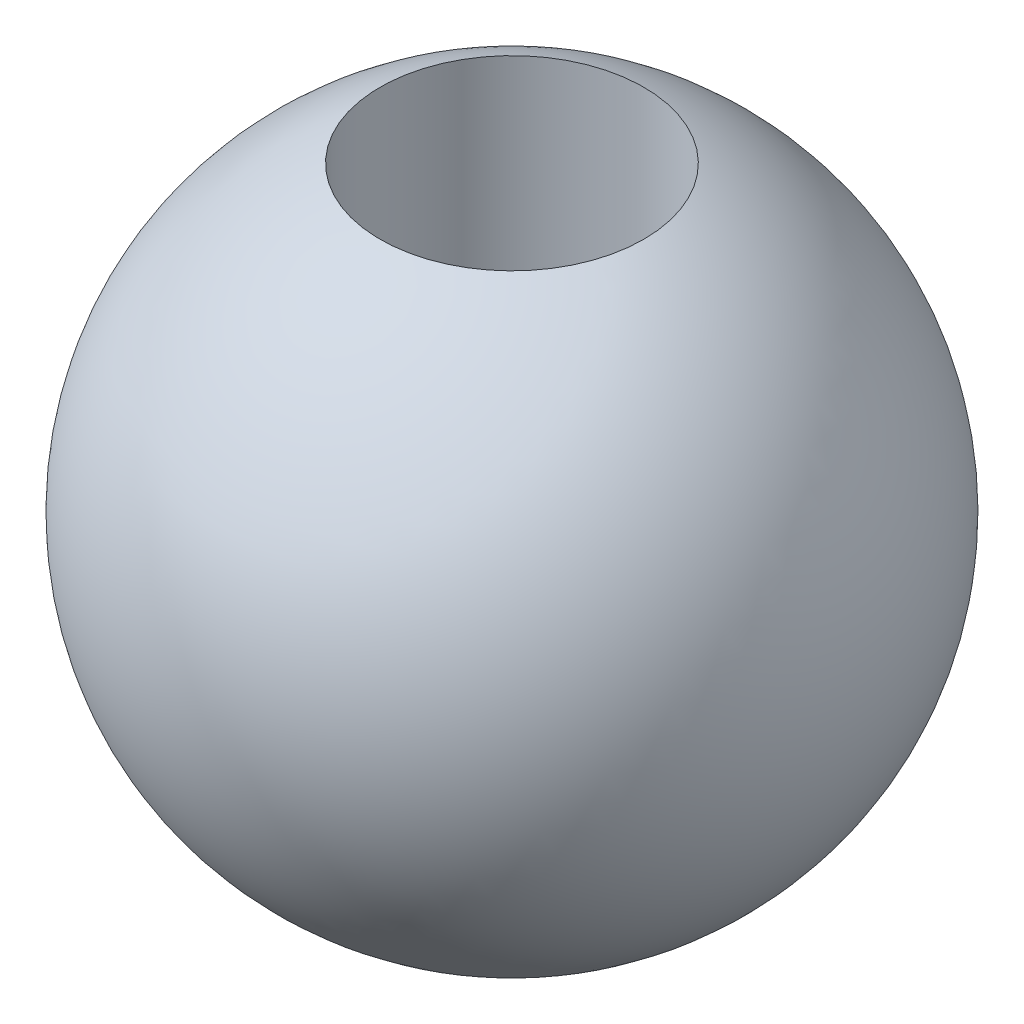
ISO-10303-21;
HEADER;
FILE_DESCRIPTION(('STEP AP214'),'2;1');
FILE_NAME('part.step','',(''),(''),'','','');
FILE_SCHEMA(('AUTOMOTIVE_DESIGN { 1 0 10303 214 1 1 1 1 }'));
ENDSEC;
DATA;
#1=APPLICATION_CONTEXT('core data for automotive mechanical design processes');
#2=APPLICATION_PROTOCOL_DEFINITION('international standard','automotive_design',2000,#1);
#3=PRODUCT_CONTEXT('',#1,'mechanical');
#4=PRODUCT('Part','Part','',(#3));
#5=PRODUCT_RELATED_PRODUCT_CATEGORY('part','',(#4));
#6=PRODUCT_DEFINITION_FORMATION('','',#4);
#7=PRODUCT_DEFINITION_CONTEXT('part definition',#1,'design');
#8=PRODUCT_DEFINITION('design','',#6,#7);
#9=PRODUCT_DEFINITION_SHAPE('','',#8);
#10=(LENGTH_UNIT() NAMED_UNIT(*) SI_UNIT(.MILLI.,.METRE.));
#11=(NAMED_UNIT(*) PLANE_ANGLE_UNIT() SI_UNIT($,.RADIAN.));
#12=(NAMED_UNIT(*) SI_UNIT($,.STERADIAN.) SOLID_ANGLE_UNIT());
#13=UNCERTAINTY_MEASURE_WITH_UNIT(LENGTH_MEASURE(1.E-05),#10,'distance_accuracy_value','');
#14=(GEOMETRIC_REPRESENTATION_CONTEXT(3) GLOBAL_UNCERTAINTY_ASSIGNED_CONTEXT((#13)) GLOBAL_UNIT_ASSIGNED_CONTEXT((#10,
#11,#12)) REPRESENTATION_CONTEXT('',''));
#15=CARTESIAN_POINT('',(0.,0.,0.));
#16=DIRECTION('',(0.,0.,1.));
#17=DIRECTION('',(1.,0.,0.));
#18=AXIS2_PLACEMENT_3D('',#15,#16,#17);
#19=CARTESIAN_POINT('',(0.,0.,0.));
#20=DIRECTION('',(0.,-1.,0.));
#21=DIRECTION('',(1.,0.,0.));
#22=AXIS2_PLACEMENT_3D('',#19,#20,#21);
#23=SPHERICAL_SURFACE('',#22,2.5);
#24=CARTESIAN_POINT('',(0.,2.29128784747792,0.));
#25=DIRECTION('',(0.,-1.,0.));
#26=DIRECTION('',(0.,0.,-1.));
#27=AXIS2_PLACEMENT_3D('',#24,#25,#26);
#28=CIRCLE('',#27,1.);
#29=CARTESIAN_POINT('',(0.999999999999999,2.29128784747792,0.));
#30=VERTEX_POINT('',#29);
#31=EDGE_CURVE('E10',#30,#30,#28,.T.);
#32=CARTESIAN_POINT('',(0.,-2.29128784747792,0.));
#33=DIRECTION('',(0.,1.,0.));
#34=DIRECTION('',(0.,0.,1.));
#35=AXIS2_PLACEMENT_3D('',#32,#33,#34);
#36=CIRCLE('',#35,1.);
#37=CARTESIAN_POINT('',(0.999999999999999,-2.29128784747792,0.));
#38=VERTEX_POINT('',#37);
#39=EDGE_CURVE('E45',#38,#38,#36,.T.);
#40=CARTESIAN_POINT('',(0.999999999999999,2.29128784747792,0.));
#41=CARTESIAN_POINT('',(1.05534030585969,2.26713984552259,0.));
#42=CARTESIAN_POINT('',(1.1098019517085,2.24097987322675,0.));
#43=CARTESIAN_POINT('',(1.21669056048761,2.18478927921392,0.));
#44=CARTESIAN_POINT('',(1.26911752341793,2.15475865749693,0.));
#45=CARTESIAN_POINT('',(1.37165940346336,2.09098005590165,0.));
#46=CARTESIAN_POINT('',(1.42177432057847,2.05723207602337,0.));
#47=CARTESIAN_POINT('',(1.51942973923918,1.98619699822935,0.));
#48=CARTESIAN_POINT('',(1.56697024078477,1.94890990031363,0.));
#49=CARTESIAN_POINT('',(1.65922720104435,1.87099193956855,0.));
#50=CARTESIAN_POINT('',(1.70394365975834,1.83036107673919,0.));
#51=CARTESIAN_POINT('',(1.79031793144863,1.74596887618961,0.));
#52=CARTESIAN_POINT('',(1.83197574442494,1.70220753846939,0.));
#53=CARTESIAN_POINT('',(1.9120141167145,1.61178400039807,0.));
#54=CARTESIAN_POINT('',(1.95039467602776,1.56512180004697,0.));
#55=CARTESIAN_POINT('',(2.02367714495927,1.46914139908999,0.));
#56=CARTESIAN_POINT('',(2.05857905457754,1.41982319848411,0.));
#57=CARTESIAN_POINT('',(2.12472107809284,1.31878958904172,0.));
#58=CARTESIAN_POINT('',(2.15596119198988,1.2670741802052,0.));
#59=CARTESIAN_POINT('',(2.21461569409772,1.16151752751284,0.));
#60=CARTESIAN_POINT('',(2.24203008230852,1.10767628365699,0.));
#61=CARTESIAN_POINT('',(2.29288927800792,0.998150488759765,0.));
#62=CARTESIAN_POINT('',(2.31633408549652,0.942465937718377,0.));
#63=CARTESIAN_POINT('',(2.35913109487308,0.82954572904666,0.));
#64=CARTESIAN_POINT('',(2.37848329676103,0.772310071416331,0.));
#65=CARTESIAN_POINT('',(2.41299354568285,0.656587989441777,0.));
#66=CARTESIAN_POINT('',(2.42815159271671,0.598101565097551,0.));
#67=CARTESIAN_POINT('',(2.45419399120001,0.480184852886519,0.));
#68=CARTESIAN_POINT('',(2.46507834264944,0.420754565019713,0.));
#69=CARTESIAN_POINT('',(2.48251623513376,0.301261981806128,0.));
#70=CARTESIAN_POINT('',(2.48906977616866,0.24119968645935,0.));
#71=CARTESIAN_POINT('',(2.49781165860178,0.120758260741715,0.));
#72=CARTESIAN_POINT('',(2.5,0.0603791303708578,0.));
#73=CARTESIAN_POINT('',(2.5,-0.0603791303708562,0.));
#74=CARTESIAN_POINT('',(2.49781165860178,-0.120758260741713,0.));
#75=CARTESIAN_POINT('',(2.48906977616866,-0.241199686459348,0.));
#76=CARTESIAN_POINT('',(2.48251623513376,-0.301261981806126,0.));
#77=CARTESIAN_POINT('',(2.46507834264944,-0.420754565019711,0.));
#78=CARTESIAN_POINT('',(2.45419399120001,-0.480184852886518,0.));
#79=CARTESIAN_POINT('',(2.42815159271671,-0.59810156509755,0.));
#80=CARTESIAN_POINT('',(2.41299354568285,-0.656587989441775,0.));
#81=CARTESIAN_POINT('',(2.37848329676103,-0.772310071416329,0.));
#82=CARTESIAN_POINT('',(2.35913109487308,-0.829545729046658,0.));
#83=CARTESIAN_POINT('',(2.31633408549653,-0.942465937718376,0.));
#84=CARTESIAN_POINT('',(2.29288927800792,-0.998150488759764,0.));
#85=CARTESIAN_POINT('',(2.24203008230852,-1.10767628365699,0.));
#86=CARTESIAN_POINT('',(2.21461569409772,-1.16151752751283,0.));
#87=CARTESIAN_POINT('',(2.15596119198988,-1.2670741802052,0.));
#88=CARTESIAN_POINT('',(2.12472107809284,-1.31878958904172,0.));
#89=CARTESIAN_POINT('',(2.05857905457754,-1.41982319848411,0.));
#90=CARTESIAN_POINT('',(2.02367714495927,-1.46914139908999,0.));
#91=CARTESIAN_POINT('',(1.95039467602776,-1.56512180004696,0.));
#92=CARTESIAN_POINT('',(1.9120141167145,-1.61178400039806,0.));
#93=CARTESIAN_POINT('',(1.83197574442494,-1.70220753846939,0.));
#94=CARTESIAN_POINT('',(1.79031793144863,-1.74596887618961,0.));
#95=CARTESIAN_POINT('',(1.70394365975834,-1.83036107673919,0.));
#96=CARTESIAN_POINT('',(1.65922720104435,-1.87099193956854,0.));
#97=CARTESIAN_POINT('',(1.56697024078477,-1.94890990031363,0.));
#98=CARTESIAN_POINT('',(1.51942973923918,-1.98619699822935,0.));
#99=CARTESIAN_POINT('',(1.42177432057847,-2.05723207602337,0.));
#100=CARTESIAN_POINT('',(1.37165940346335,-2.09098005590165,0.));
#101=CARTESIAN_POINT('',(1.26911752341793,-2.15475865749693,0.));
#102=CARTESIAN_POINT('',(1.21669056048761,-2.18478927921392,0.));
#103=CARTESIAN_POINT('',(1.1098019517085,-2.24097987322675,0.));
#104=CARTESIAN_POINT('',(1.05534030585969,-2.26713984552259,0.));
#105=CARTESIAN_POINT('',(0.999999999999999,-2.29128784747792,0.));
#106=B_SPLINE_CURVE_WITH_KNOTS('',3,(#40,#41,#42,#43,#44,#45,#46,#47,#48,#49,#50,#51,#52,#53,
#54,#55,#56,#57,#58,#59,#60,#61,#62,#63,#64,#65,#66,#67,#68,#69,#70,#71,#72,#73,#74,#75,#76,#77,
#78,#79,#80,#81,#82,#83,#84,#85,#86,#87,#88,#89,#90,#91,#92,#93,#94,#95,#96,#97,#98,#99,#100,
#101,#102,#103,#104,#105),.UNSPECIFIED.,.F.,.F.,(4,2,2,2,2,2,2,2,2,2,2,2,2,2,2,2,2,2,2,2,2,2,2,
2,2,2,2,2,2,2,2,2,4),(0.,0.181097799748982,0.362195599497965,0.543293399246947,
0.724391198995929,0.905488998744911,1.08658679849389,1.26768459824288,1.44878239799186,
1.62988019774084,1.81097799748982,1.9920757972388,2.17317359698779,2.35427139673677,
2.53536919648575,2.71646699623473,2.89756479598372,3.0786625957327,3.25976039548168,
3.44085819523066,3.62195599497964,3.80305379472863,3.98415159447761,4.16524939422659,
4.34634719397557,4.52744499372456,4.70854279347354,4.88964059322252,5.0707383929715,
5.25183619272048,5.43293399246947,5.61403179221845,5.79512959196743),.UNSPECIFIED.);
#107=EDGE_CURVE('BSEAM39',#30,#38,#106,.T.);
#108=ORIENTED_EDGE('',*,*,#31,.T.);
#109=ORIENTED_EDGE('',*,*,#39,.T.);
#110=ORIENTED_EDGE('',*,*,#107,.T.);
#111=ORIENTED_EDGE('',*,*,#107,.F.);
#112=EDGE_LOOP('',(#108,#110,#109,#111));
#113=FACE_BOUND('',#112,.T.);
#114=ADVANCED_FACE('F39',(#113),#23,.T.);
#115=CARTESIAN_POINT('',(0.,-5.,0.));
#116=DIRECTION('',(0.,1.,0.));
#117=DIRECTION('',(0.,0.,1.));
#118=AXIS2_PLACEMENT_3D('',#115,#116,#117);
#119=CYLINDRICAL_SURFACE('',#118,1.);
#120=ORIENTED_EDGE('',*,*,#39,.F.);
#121=EDGE_LOOP('',(#120));
#122=FACE_BOUND('',#121,.T.);
#123=ORIENTED_EDGE('',*,*,#31,.F.);
#124=EDGE_LOOP('',(#123));
#125=FACE_BOUND('',#124,.T.);
#126=ADVANCED_FACE('F52',(#122,#125),#119,.F.);
#127=CLOSED_SHELL('',(#114,#126));
#128=MANIFOLD_SOLID_BREP('B2',#127);
#129=ADVANCED_BREP_SHAPE_REPRESENTATION('',(#18,#128),#14);
#130=SHAPE_DEFINITION_REPRESENTATION(#9,#129);
ENDSEC;
END-ISO-10303-21;
